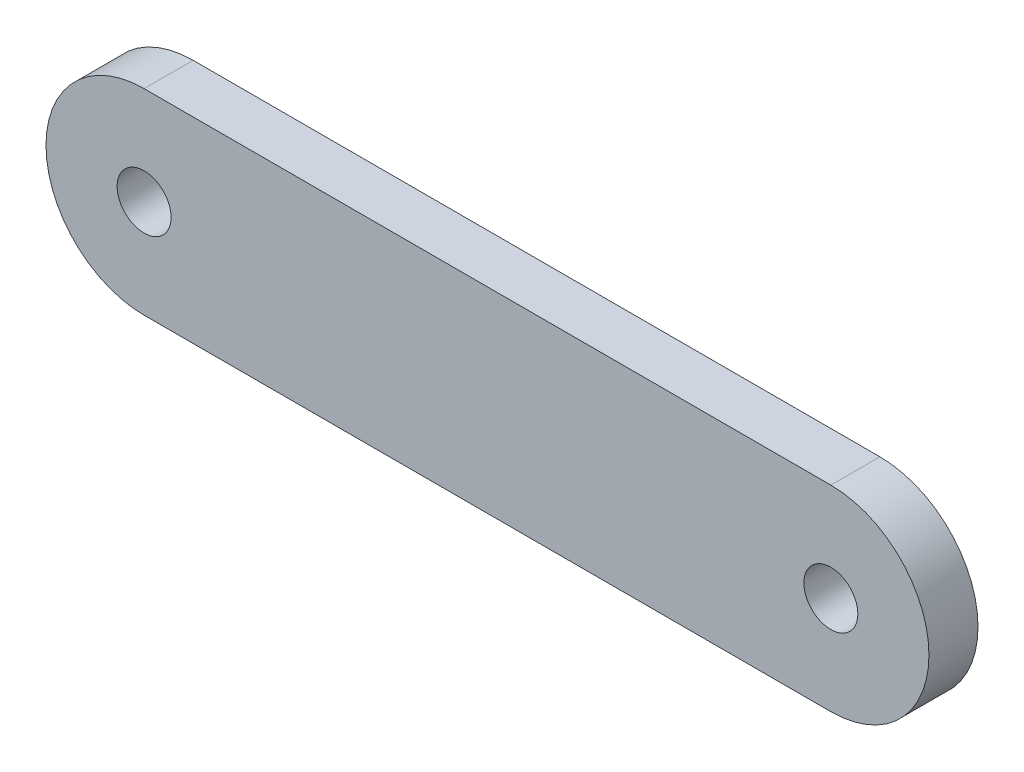
ISO-10303-21;
HEADER;
FILE_DESCRIPTION(('STEP AP214'),'2;1');
FILE_NAME('part.step','',(''),(''),'','','');
FILE_SCHEMA(('AUTOMOTIVE_DESIGN { 1 0 10303 214 1 1 1 1 }'));
ENDSEC;
DATA;
#1=APPLICATION_CONTEXT('core data for automotive mechanical design processes');
#2=APPLICATION_PROTOCOL_DEFINITION('international standard','automotive_design',2000,#1);
#3=PRODUCT_CONTEXT('',#1,'mechanical');
#4=PRODUCT('Part','Part','',(#3));
#5=PRODUCT_RELATED_PRODUCT_CATEGORY('part','',(#4));
#6=PRODUCT_DEFINITION_FORMATION('','',#4);
#7=PRODUCT_DEFINITION_CONTEXT('part definition',#1,'design');
#8=PRODUCT_DEFINITION('design','',#6,#7);
#9=PRODUCT_DEFINITION_SHAPE('','',#8);
#10=(LENGTH_UNIT() NAMED_UNIT(*) SI_UNIT(.MILLI.,.METRE.));
#11=(NAMED_UNIT(*) PLANE_ANGLE_UNIT() SI_UNIT($,.RADIAN.));
#12=(NAMED_UNIT(*) SI_UNIT($,.STERADIAN.) SOLID_ANGLE_UNIT());
#13=UNCERTAINTY_MEASURE_WITH_UNIT(LENGTH_MEASURE(1.E-05),#10,'distance_accuracy_value','');
#14=(GEOMETRIC_REPRESENTATION_CONTEXT(3) GLOBAL_UNCERTAINTY_ASSIGNED_CONTEXT((#13)) GLOBAL_UNIT_ASSIGNED_CONTEXT((#10,
#11,#12)) REPRESENTATION_CONTEXT('',''));
#15=CARTESIAN_POINT('',(0.,0.,0.));
#16=DIRECTION('',(0.,0.,1.));
#17=DIRECTION('',(1.,0.,0.));
#18=AXIS2_PLACEMENT_3D('',#15,#16,#17);
#19=CARTESIAN_POINT('',(0.,20.,10.));
#20=DIRECTION('',(0.,0.,1.));
#21=DIRECTION('',(1.,0.,0.));
#22=AXIS2_PLACEMENT_3D('',#19,#20,#21);
#23=PLANE('',#22);
#24=CARTESIAN_POINT('',(0.,20.,10.));
#25=DIRECTION('',(0.,0.,1.));
#26=DIRECTION('',(1.,0.,0.));
#27=AXIS2_PLACEMENT_3D('',#24,#25,#26);
#28=CIRCLE('',#27,5.5);
#29=CARTESIAN_POINT('',(5.5,20.,10.));
#30=VERTEX_POINT('',#29);
#31=EDGE_CURVE('E100',#30,#30,#28,.T.);
#32=ORIENTED_EDGE('',*,*,#31,.F.);
#33=EDGE_LOOP('',(#32));
#34=FACE_BOUND('',#33,.T.);
#35=CARTESIAN_POINT('',(0.,20.,10.));
#36=DIRECTION('',(0.,0.,1.));
#37=DIRECTION('',(1.,0.,0.));
#38=AXIS2_PLACEMENT_3D('',#35,#36,#37);
#39=CIRCLE('',#38,20.);
#40=CARTESIAN_POINT('',(0.,40.,10.));
#41=VERTEX_POINT('',#40);
#42=CARTESIAN_POINT('',(0.,0.,10.));
#43=VERTEX_POINT('',#42);
#44=EDGE_CURVE('E85',#41,#43,#39,.T.);
#45=ORIENTED_EDGE('',*,*,#44,.T.);
#46=DIRECTION('',(1.,0.,0.));
#47=VECTOR('',#46,1.);
#48=CARTESIAN_POINT('',(0.,0.,10.));
#49=LINE('',#48,#47);
#50=CARTESIAN_POINT('',(140.,0.,10.));
#51=VERTEX_POINT('',#50);
#52=EDGE_CURVE('E80',#43,#51,#49,.T.);
#53=ORIENTED_EDGE('',*,*,#52,.T.);
#54=CARTESIAN_POINT('',(140.,20.,10.));
#55=DIRECTION('',(0.,0.,1.));
#56=DIRECTION('',(1.,0.,0.));
#57=AXIS2_PLACEMENT_3D('',#54,#55,#56);
#58=CIRCLE('',#57,20.);
#59=CARTESIAN_POINT('',(140.,40.,10.));
#60=VERTEX_POINT('',#59);
#61=EDGE_CURVE('E83',#51,#60,#58,.T.);
#62=ORIENTED_EDGE('',*,*,#61,.T.);
#63=DIRECTION('',(-1.,0.,0.));
#64=VECTOR('',#63,1.);
#65=CARTESIAN_POINT('',(140.,40.,10.));
#66=LINE('',#65,#64);
#67=EDGE_CURVE('E50',#60,#41,#66,.T.);
#68=ORIENTED_EDGE('',*,*,#67,.T.);
#69=EDGE_LOOP('',(#45,#53,#62,#68));
#70=FACE_BOUND('',#69,.T.);
#71=CARTESIAN_POINT('',(140.,20.,10.));
#72=DIRECTION('',(0.,0.,1.));
#73=DIRECTION('',(1.,0.,0.));
#74=AXIS2_PLACEMENT_3D('',#71,#72,#73);
#75=CIRCLE('',#74,5.50000000000002);
#76=CARTESIAN_POINT('',(145.5,20.,10.));
#77=VERTEX_POINT('',#76);
#78=EDGE_CURVE('E115',#77,#77,#75,.T.);
#79=ORIENTED_EDGE('',*,*,#78,.F.);
#80=EDGE_LOOP('',(#79));
#81=FACE_BOUND('',#80,.T.);
#82=ADVANCED_FACE('F33',(#34,#70,#81),#23,.T.);
#83=CARTESIAN_POINT('',(0.,20.,0.));
#84=DIRECTION('',(0.,0.,1.));
#85=DIRECTION('',(1.,0.,0.));
#86=AXIS2_PLACEMENT_3D('',#83,#84,#85);
#87=PLANE('',#86);
#88=CARTESIAN_POINT('',(0.,20.,0.));
#89=DIRECTION('',(0.,0.,1.));
#90=DIRECTION('',(1.,0.,0.));
#91=AXIS2_PLACEMENT_3D('',#88,#89,#90);
#92=CIRCLE('',#91,20.);
#93=CARTESIAN_POINT('',(0.,40.,0.));
#94=VERTEX_POINT('',#93);
#95=CARTESIAN_POINT('',(0.,0.,0.));
#96=VERTEX_POINT('',#95);
#97=EDGE_CURVE('E97',#94,#96,#92,.T.);
#98=ORIENTED_EDGE('',*,*,#97,.F.);
#99=DIRECTION('',(-1.,0.,0.));
#100=VECTOR('',#99,1.);
#101=CARTESIAN_POINT('',(140.,40.,0.));
#102=LINE('',#101,#100);
#103=CARTESIAN_POINT('',(140.,40.,0.));
#104=VERTEX_POINT('',#103);
#105=EDGE_CURVE('E73',#104,#94,#102,.T.);
#106=ORIENTED_EDGE('',*,*,#105,.F.);
#107=CARTESIAN_POINT('',(140.,20.,0.));
#108=DIRECTION('',(0.,0.,1.));
#109=DIRECTION('',(1.,0.,0.));
#110=AXIS2_PLACEMENT_3D('',#107,#108,#109);
#111=CIRCLE('',#110,20.);
#112=CARTESIAN_POINT('',(140.,0.,0.));
#113=VERTEX_POINT('',#112);
#114=EDGE_CURVE('E67',#113,#104,#111,.T.);
#115=ORIENTED_EDGE('',*,*,#114,.F.);
#116=DIRECTION('',(1.,0.,0.));
#117=VECTOR('',#116,1.);
#118=CARTESIAN_POINT('',(0.,0.,0.));
#119=LINE('',#118,#117);
#120=EDGE_CURVE('E89',#96,#113,#119,.T.);
#121=ORIENTED_EDGE('',*,*,#120,.F.);
#122=EDGE_LOOP('',(#98,#106,#115,#121));
#123=FACE_BOUND('',#122,.T.);
#124=CARTESIAN_POINT('',(0.,20.,0.));
#125=DIRECTION('',(0.,0.,1.));
#126=DIRECTION('',(1.,0.,0.));
#127=AXIS2_PLACEMENT_3D('',#124,#125,#126);
#128=CIRCLE('',#127,5.5);
#129=CARTESIAN_POINT('',(5.5,20.,0.));
#130=VERTEX_POINT('',#129);
#131=EDGE_CURVE('E112',#130,#130,#128,.T.);
#132=ORIENTED_EDGE('',*,*,#131,.T.);
#133=EDGE_LOOP('',(#132));
#134=FACE_BOUND('',#133,.T.);
#135=CARTESIAN_POINT('',(140.,20.,0.));
#136=DIRECTION('',(0.,0.,1.));
#137=DIRECTION('',(1.,0.,0.));
#138=AXIS2_PLACEMENT_3D('',#135,#136,#137);
#139=CIRCLE('',#138,5.50000000000002);
#140=CARTESIAN_POINT('',(145.5,20.,0.));
#141=VERTEX_POINT('',#140);
#142=EDGE_CURVE('E118',#141,#141,#139,.T.);
#143=ORIENTED_EDGE('',*,*,#142,.T.);
#144=EDGE_LOOP('',(#143));
#145=FACE_BOUND('',#144,.T.);
#146=ADVANCED_FACE('F108',(#123,#134,#145),#87,.F.);
#147=CARTESIAN_POINT('',(0.,20.,10.));
#148=DIRECTION('',(0.,0.,-1.));
#149=DIRECTION('',(-1.,0.,0.));
#150=AXIS2_PLACEMENT_3D('',#147,#148,#149);
#151=CYLINDRICAL_SURFACE('',#150,20.);
#152=ORIENTED_EDGE('',*,*,#97,.T.);
#153=DIRECTION('',(0.,0.,-1.));
#154=VECTOR('',#153,1.);
#155=CARTESIAN_POINT('',(0.,0.,10.));
#156=LINE('',#155,#154);
#157=EDGE_CURVE('E11',#43,#96,#156,.T.);
#158=ORIENTED_EDGE('',*,*,#157,.F.);
#159=ORIENTED_EDGE('',*,*,#44,.F.);
#160=DIRECTION('',(0.,0.,-1.));
#161=VECTOR('',#160,1.);
#162=CARTESIAN_POINT('',(0.,40.,10.));
#163=LINE('',#162,#161);
#164=EDGE_CURVE('E93',#41,#94,#163,.T.);
#165=ORIENTED_EDGE('',*,*,#164,.T.);
#166=EDGE_LOOP('',(#152,#158,#159,#165));
#167=FACE_BOUND('',#166,.T.);
#168=ADVANCED_FACE('F35',(#167),#151,.T.);
#169=CARTESIAN_POINT('',(0.,0.,10.));
#170=DIRECTION('',(0.,1.,0.));
#171=DIRECTION('',(0.,0.,1.));
#172=AXIS2_PLACEMENT_3D('',#169,#170,#171);
#173=PLANE('',#172);
#174=ORIENTED_EDGE('',*,*,#120,.T.);
#175=DIRECTION('',(0.,0.,-1.));
#176=VECTOR('',#175,1.);
#177=CARTESIAN_POINT('',(140.,0.,10.));
#178=LINE('',#177,#176);
#179=EDGE_CURVE('E42',#51,#113,#178,.T.);
#180=ORIENTED_EDGE('',*,*,#179,.F.);
#181=ORIENTED_EDGE('',*,*,#52,.F.);
#182=ORIENTED_EDGE('',*,*,#157,.T.);
#183=EDGE_LOOP('',(#174,#180,#181,#182));
#184=FACE_BOUND('',#183,.T.);
#185=ADVANCED_FACE('F88',(#184),#173,.F.);
#186=CARTESIAN_POINT('',(140.,20.,10.));
#187=DIRECTION('',(0.,0.,-1.));
#188=DIRECTION('',(-1.,0.,0.));
#189=AXIS2_PLACEMENT_3D('',#186,#187,#188);
#190=CYLINDRICAL_SURFACE('',#189,20.);
#191=ORIENTED_EDGE('',*,*,#114,.T.);
#192=DIRECTION('',(0.,0.,-1.));
#193=VECTOR('',#192,1.);
#194=CARTESIAN_POINT('',(140.,40.,10.));
#195=LINE('',#194,#193);
#196=EDGE_CURVE('E90',#60,#104,#195,.T.);
#197=ORIENTED_EDGE('',*,*,#196,.F.);
#198=ORIENTED_EDGE('',*,*,#61,.F.);
#199=ORIENTED_EDGE('',*,*,#179,.T.);
#200=EDGE_LOOP('',(#191,#197,#198,#199));
#201=FACE_BOUND('',#200,.T.);
#202=ADVANCED_FACE('F91',(#201),#190,.T.);
#203=CARTESIAN_POINT('',(140.,40.,10.));
#204=DIRECTION('',(0.,-1.,0.));
#205=DIRECTION('',(1.,0.,0.));
#206=AXIS2_PLACEMENT_3D('',#203,#204,#205);
#207=PLANE('',#206);
#208=ORIENTED_EDGE('',*,*,#105,.T.);
#209=ORIENTED_EDGE('',*,*,#164,.F.);
#210=ORIENTED_EDGE('',*,*,#67,.F.);
#211=ORIENTED_EDGE('',*,*,#196,.T.);
#212=EDGE_LOOP('',(#208,#209,#210,#211));
#213=FACE_BOUND('',#212,.T.);
#214=ADVANCED_FACE('F105',(#213),#207,.F.);
#215=CARTESIAN_POINT('',(0.,20.,10.));
#216=DIRECTION('',(0.,0.,-1.));
#217=DIRECTION('',(-1.,0.,0.));
#218=AXIS2_PLACEMENT_3D('',#215,#216,#217);
#219=CYLINDRICAL_SURFACE('',#218,5.5);
#220=ORIENTED_EDGE('',*,*,#31,.T.);
#221=EDGE_LOOP('',(#220));
#222=FACE_BOUND('',#221,.T.);
#223=ORIENTED_EDGE('',*,*,#131,.F.);
#224=EDGE_LOOP('',(#223));
#225=FACE_BOUND('',#224,.T.);
#226=ADVANCED_FACE('F135',(#222,#225),#219,.F.);
#227=CARTESIAN_POINT('',(140.,20.,10.));
#228=DIRECTION('',(0.,0.,-1.));
#229=DIRECTION('',(-1.,0.,0.));
#230=AXIS2_PLACEMENT_3D('',#227,#228,#229);
#231=CYLINDRICAL_SURFACE('',#230,5.50000000000002);
#232=ORIENTED_EDGE('',*,*,#78,.T.);
#233=EDGE_LOOP('',(#232));
#234=FACE_BOUND('',#233,.T.);
#235=ORIENTED_EDGE('',*,*,#142,.F.);
#236=EDGE_LOOP('',(#235));
#237=FACE_BOUND('',#236,.T.);
#238=ADVANCED_FACE('F124',(#234,#237),#231,.F.);
#239=CLOSED_SHELL('',(#82,#146,#168,#185,#202,#214,#226,#238));
#240=MANIFOLD_SOLID_BREP('B2',#239);
#241=ADVANCED_BREP_SHAPE_REPRESENTATION('',(#18,#240),#14);
#242=SHAPE_DEFINITION_REPRESENTATION(#9,#241);
ENDSEC;
END-ISO-10303-21;
